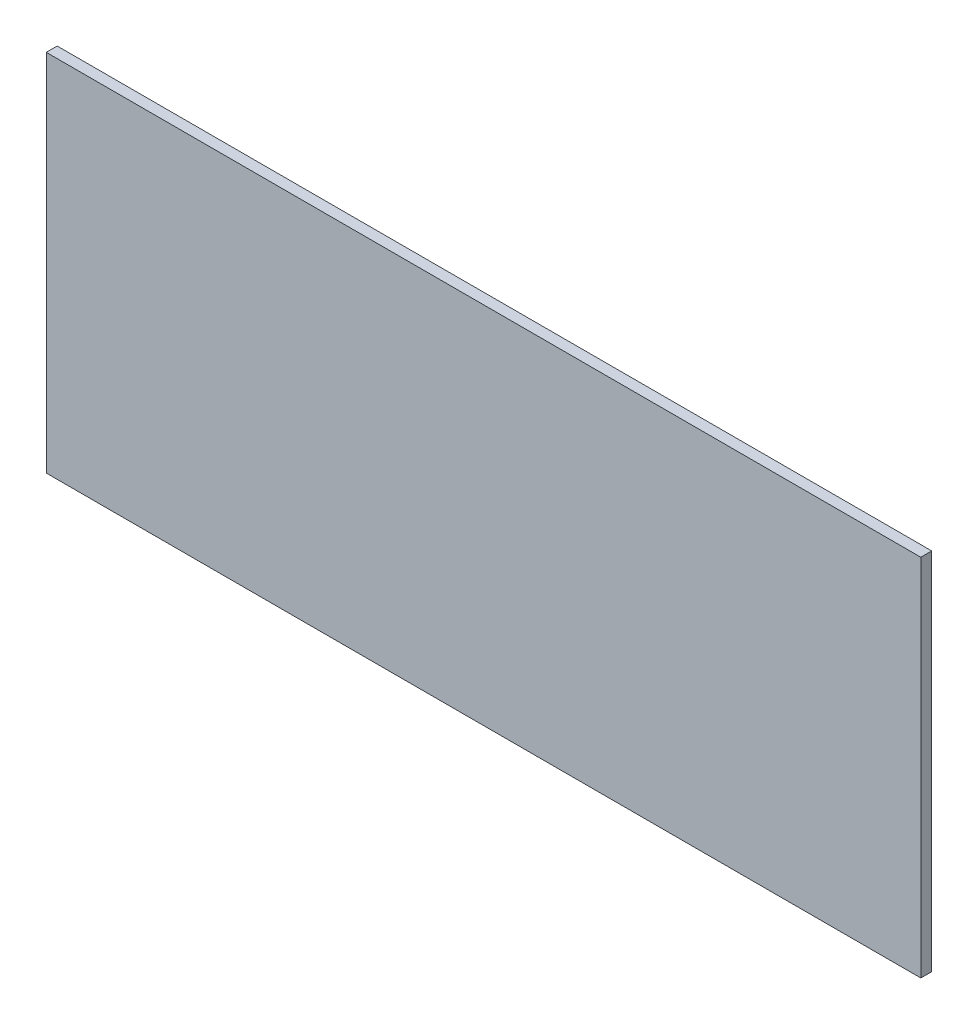
ISO-10303-21;
HEADER;
FILE_DESCRIPTION(('STEP AP214'),'2;1');
FILE_NAME('part.step','',(''),(''),'','','');
FILE_SCHEMA(('AUTOMOTIVE_DESIGN { 1 0 10303 214 1 1 1 1 }'));
ENDSEC;
DATA;
#1=APPLICATION_CONTEXT('core data for automotive mechanical design processes');
#2=APPLICATION_PROTOCOL_DEFINITION('international standard','automotive_design',2000,#1);
#3=PRODUCT_CONTEXT('',#1,'mechanical');
#4=PRODUCT('Part','Part','',(#3));
#5=PRODUCT_RELATED_PRODUCT_CATEGORY('part','',(#4));
#6=PRODUCT_DEFINITION_FORMATION('','',#4);
#7=PRODUCT_DEFINITION_CONTEXT('part definition',#1,'design');
#8=PRODUCT_DEFINITION('design','',#6,#7);
#9=PRODUCT_DEFINITION_SHAPE('','',#8);
#10=(LENGTH_UNIT() NAMED_UNIT(*) SI_UNIT(.MILLI.,.METRE.));
#11=(NAMED_UNIT(*) PLANE_ANGLE_UNIT() SI_UNIT($,.RADIAN.));
#12=(NAMED_UNIT(*) SI_UNIT($,.STERADIAN.) SOLID_ANGLE_UNIT());
#13=UNCERTAINTY_MEASURE_WITH_UNIT(LENGTH_MEASURE(1.E-05),#10,'distance_accuracy_value','');
#14=(GEOMETRIC_REPRESENTATION_CONTEXT(3) GLOBAL_UNCERTAINTY_ASSIGNED_CONTEXT((#13)) GLOBAL_UNIT_ASSIGNED_CONTEXT((#10,
#11,#12)) REPRESENTATION_CONTEXT('',''));
#15=CARTESIAN_POINT('',(0.,0.,0.));
#16=DIRECTION('',(0.,0.,1.));
#17=DIRECTION('',(1.,0.,0.));
#18=AXIS2_PLACEMENT_3D('',#15,#16,#17);
#19=CARTESIAN_POINT('',(0.,0.,15.));
#20=DIRECTION('',(1.,0.,0.));
#21=DIRECTION('',(0.,0.,-1.));
#22=AXIS2_PLACEMENT_3D('',#19,#20,#21);
#23=PLANE('',#22);
#24=DIRECTION('',(0.,-1.,0.));
#25=VECTOR('',#24,1.);
#26=CARTESIAN_POINT('',(0.,0.,0.));
#27=LINE('',#26,#25);
#28=CARTESIAN_POINT('',(0.,500.,0.));
#29=VERTEX_POINT('',#28);
#30=CARTESIAN_POINT('',(0.,0.,0.));
#31=VERTEX_POINT('',#30);
#32=EDGE_CURVE('E104',#29,#31,#27,.T.);
#33=ORIENTED_EDGE('',*,*,#32,.T.);
#34=DIRECTION('',(0.,0.,-1.));
#35=VECTOR('',#34,1.);
#36=CARTESIAN_POINT('',(0.,0.,15.));
#37=LINE('',#36,#35);
#38=CARTESIAN_POINT('',(0.,0.,15.));
#39=VERTEX_POINT('',#38);
#40=EDGE_CURVE('E11',#39,#31,#37,.T.);
#41=ORIENTED_EDGE('',*,*,#40,.F.);
#42=DIRECTION('',(0.,-1.,0.));
#43=VECTOR('',#42,1.);
#44=CARTESIAN_POINT('',(0.,0.,15.));
#45=LINE('',#44,#43);
#46=CARTESIAN_POINT('',(0.,500.,15.));
#47=VERTEX_POINT('',#46);
#48=EDGE_CURVE('E88',#47,#39,#45,.T.);
#49=ORIENTED_EDGE('',*,*,#48,.F.);
#50=DIRECTION('',(0.,0.,-1.));
#51=VECTOR('',#50,1.);
#52=CARTESIAN_POINT('',(0.,500.,15.));
#53=LINE('',#52,#51);
#54=EDGE_CURVE('E100',#47,#29,#53,.T.);
#55=ORIENTED_EDGE('',*,*,#54,.T.);
#56=EDGE_LOOP('',(#33,#41,#49,#55));
#57=FACE_BOUND('',#56,.T.);
#58=ADVANCED_FACE('F36',(#57),#23,.F.);
#59=CARTESIAN_POINT('',(0.,0.,15.));
#60=DIRECTION('',(0.,1.,0.));
#61=DIRECTION('',(0.,0.,1.));
#62=AXIS2_PLACEMENT_3D('',#59,#60,#61);
#63=PLANE('',#62);
#64=DIRECTION('',(1.,0.,0.));
#65=VECTOR('',#64,1.);
#66=CARTESIAN_POINT('',(0.,0.,0.));
#67=LINE('',#66,#65);
#68=CARTESIAN_POINT('',(1200.,0.,0.));
#69=VERTEX_POINT('',#68);
#70=EDGE_CURVE('E93',#31,#69,#67,.T.);
#71=ORIENTED_EDGE('',*,*,#70,.T.);
#72=DIRECTION('',(0.,0.,-1.));
#73=VECTOR('',#72,1.);
#74=CARTESIAN_POINT('',(1200.,0.,15.));
#75=LINE('',#74,#73);
#76=CARTESIAN_POINT('',(1200.,0.,15.));
#77=VERTEX_POINT('',#76);
#78=EDGE_CURVE('E45',#77,#69,#75,.T.);
#79=ORIENTED_EDGE('',*,*,#78,.F.);
#80=DIRECTION('',(1.,0.,0.));
#81=VECTOR('',#80,1.);
#82=CARTESIAN_POINT('',(0.,0.,15.));
#83=LINE('',#82,#81);
#84=EDGE_CURVE('E83',#39,#77,#83,.T.);
#85=ORIENTED_EDGE('',*,*,#84,.F.);
#86=ORIENTED_EDGE('',*,*,#40,.T.);
#87=EDGE_LOOP('',(#71,#79,#85,#86));
#88=FACE_BOUND('',#87,.T.);
#89=ADVANCED_FACE('F92',(#88),#63,.F.);
#90=CARTESIAN_POINT('',(1200.,0.,15.));
#91=DIRECTION('',(-1.,0.,0.));
#92=DIRECTION('',(0.,0.,1.));
#93=AXIS2_PLACEMENT_3D('',#90,#91,#92);
#94=PLANE('',#93);
#95=DIRECTION('',(0.,1.,0.));
#96=VECTOR('',#95,1.);
#97=CARTESIAN_POINT('',(1200.,0.,0.));
#98=LINE('',#97,#96);
#99=CARTESIAN_POINT('',(1200.,500.,0.));
#100=VERTEX_POINT('',#99);
#101=EDGE_CURVE('E70',#69,#100,#98,.T.);
#102=ORIENTED_EDGE('',*,*,#101,.T.);
#103=DIRECTION('',(0.,0.,-1.));
#104=VECTOR('',#103,1.);
#105=CARTESIAN_POINT('',(1200.,500.,15.));
#106=LINE('',#105,#104);
#107=CARTESIAN_POINT('',(1200.,500.,15.));
#108=VERTEX_POINT('',#107);
#109=EDGE_CURVE('E95',#108,#100,#106,.T.);
#110=ORIENTED_EDGE('',*,*,#109,.F.);
#111=DIRECTION('',(0.,1.,0.));
#112=VECTOR('',#111,1.);
#113=CARTESIAN_POINT('',(1200.,0.,15.));
#114=LINE('',#113,#112);
#115=EDGE_CURVE('E86',#77,#108,#114,.T.);
#116=ORIENTED_EDGE('',*,*,#115,.F.);
#117=ORIENTED_EDGE('',*,*,#78,.T.);
#118=EDGE_LOOP('',(#102,#110,#116,#117));
#119=FACE_BOUND('',#118,.T.);
#120=ADVANCED_FACE('F96',(#119),#94,.F.);
#121=CARTESIAN_POINT('',(0.,500.,15.));
#122=DIRECTION('',(0.,-1.,0.));
#123=DIRECTION('',(0.,0.,-1.));
#124=AXIS2_PLACEMENT_3D('',#121,#122,#123);
#125=PLANE('',#124);
#126=DIRECTION('',(-1.,0.,0.));
#127=VECTOR('',#126,1.);
#128=CARTESIAN_POINT('',(0.,500.,0.));
#129=LINE('',#128,#127);
#130=EDGE_CURVE('E76',#100,#29,#129,.T.);
#131=ORIENTED_EDGE('',*,*,#130,.T.);
#132=ORIENTED_EDGE('',*,*,#54,.F.);
#133=DIRECTION('',(-1.,0.,0.));
#134=VECTOR('',#133,1.);
#135=CARTESIAN_POINT('',(0.,500.,15.));
#136=LINE('',#135,#134);
#137=EDGE_CURVE('E53',#108,#47,#136,.T.);
#138=ORIENTED_EDGE('',*,*,#137,.F.);
#139=ORIENTED_EDGE('',*,*,#109,.T.);
#140=EDGE_LOOP('',(#131,#132,#138,#139));
#141=FACE_BOUND('',#140,.T.);
#142=ADVANCED_FACE('F117',(#141),#125,.F.);
#143=CARTESIAN_POINT('',(0.,0.,15.));
#144=DIRECTION('',(0.,0.,-1.));
#145=DIRECTION('',(-1.,0.,0.));
#146=AXIS2_PLACEMENT_3D('',#143,#144,#145);
#147=PLANE('',#146);
#148=ORIENTED_EDGE('',*,*,#48,.T.);
#149=ORIENTED_EDGE('',*,*,#84,.T.);
#150=ORIENTED_EDGE('',*,*,#115,.T.);
#151=ORIENTED_EDGE('',*,*,#137,.T.);
#152=EDGE_LOOP('',(#148,#149,#150,#151));
#153=FACE_BOUND('',#152,.T.);
#154=ADVANCED_FACE('F84',(#153),#147,.F.);
#155=CARTESIAN_POINT('',(0.,0.,0.));
#156=DIRECTION('',(0.,0.,-1.));
#157=DIRECTION('',(-1.,0.,0.));
#158=AXIS2_PLACEMENT_3D('',#155,#156,#157);
#159=PLANE('',#158);
#160=ORIENTED_EDGE('',*,*,#32,.F.);
#161=ORIENTED_EDGE('',*,*,#130,.F.);
#162=ORIENTED_EDGE('',*,*,#101,.F.);
#163=ORIENTED_EDGE('',*,*,#70,.F.);
#164=EDGE_LOOP('',(#160,#161,#162,#163));
#165=FACE_BOUND('',#164,.T.);
#166=ADVANCED_FACE('F120',(#165),#159,.T.);
#167=CLOSED_SHELL('',(#58,#89,#120,#142,#154,#166));
#168=MANIFOLD_SOLID_BREP('B2',#167);
#169=ADVANCED_BREP_SHAPE_REPRESENTATION('',(#18,#168),#14);
#170=SHAPE_DEFINITION_REPRESENTATION(#9,#169);
ENDSEC;
END-ISO-10303-21;
